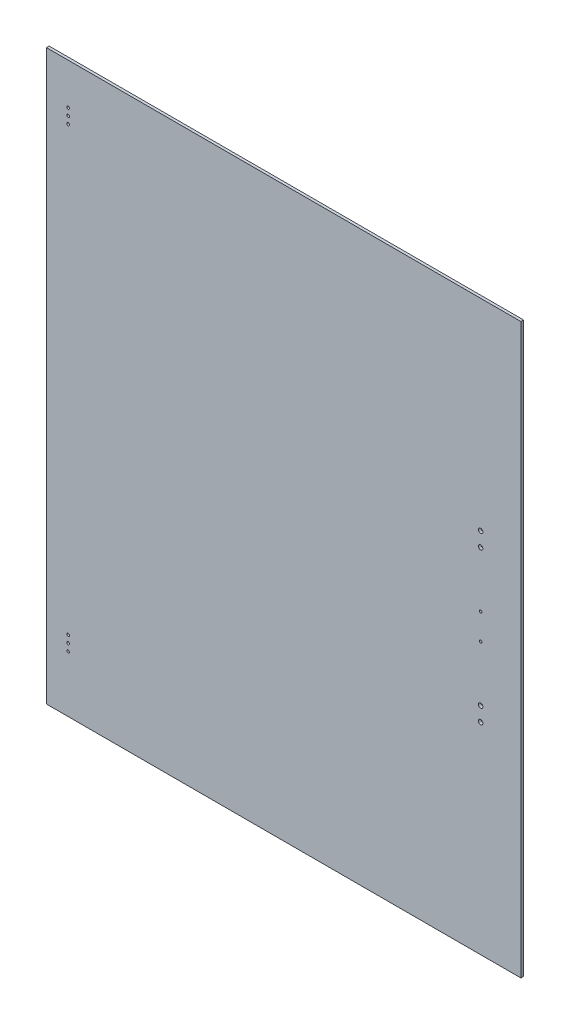
ISO-10303-21;
HEADER;
FILE_DESCRIPTION(('STEP AP214'),'2;1');
FILE_NAME('part.step','',(''),(''),'','','');
FILE_SCHEMA(('AUTOMOTIVE_DESIGN { 1 0 10303 214 1 1 1 1 }'));
ENDSEC;
DATA;
#1=APPLICATION_CONTEXT('core data for automotive mechanical design processes');
#2=APPLICATION_PROTOCOL_DEFINITION('international standard','automotive_design',2000,#1);
#3=PRODUCT_CONTEXT('',#1,'mechanical');
#4=PRODUCT('Part','Part','',(#3));
#5=PRODUCT_RELATED_PRODUCT_CATEGORY('part','',(#4));
#6=PRODUCT_DEFINITION_FORMATION('','',#4);
#7=PRODUCT_DEFINITION_CONTEXT('part definition',#1,'design');
#8=PRODUCT_DEFINITION('design','',#6,#7);
#9=PRODUCT_DEFINITION_SHAPE('','',#8);
#10=(LENGTH_UNIT() NAMED_UNIT(*) SI_UNIT(.MILLI.,.METRE.));
#11=(NAMED_UNIT(*) PLANE_ANGLE_UNIT() SI_UNIT($,.RADIAN.));
#12=(NAMED_UNIT(*) SI_UNIT($,.STERADIAN.) SOLID_ANGLE_UNIT());
#13=UNCERTAINTY_MEASURE_WITH_UNIT(LENGTH_MEASURE(1.E-05),#10,'distance_accuracy_value','');
#14=(GEOMETRIC_REPRESENTATION_CONTEXT(3) GLOBAL_UNCERTAINTY_ASSIGNED_CONTEXT((#13)) GLOBAL_UNIT_ASSIGNED_CONTEXT((#10,
#11,#12)) REPRESENTATION_CONTEXT('',''));
#15=CARTESIAN_POINT('',(0.,0.,0.));
#16=DIRECTION('',(0.,0.,1.));
#17=DIRECTION('',(1.,0.,0.));
#18=AXIS2_PLACEMENT_3D('',#15,#16,#17);
#19=CARTESIAN_POINT('',(-476.504854368932,294.757281553398,3.));
#20=DIRECTION('',(1.,0.,0.));
#21=DIRECTION('',(0.,0.,-1.));
#22=AXIS2_PLACEMENT_3D('',#19,#20,#21);
#23=PLANE('',#22);
#24=DIRECTION('',(0.,-1.,0.));
#25=VECTOR('',#24,1.);
#26=CARTESIAN_POINT('',(-476.504854368932,294.757281553398,0.));
#27=LINE('',#26,#25);
#28=CARTESIAN_POINT('',(-476.504854368932,294.757281553398,0.));
#29=VERTEX_POINT('',#28);
#30=CARTESIAN_POINT('',(-476.504854368932,-340.242718446602,0.));
#31=VERTEX_POINT('',#30);
#32=EDGE_CURVE('E96',#29,#31,#27,.T.);
#33=ORIENTED_EDGE('',*,*,#32,.T.);
#34=DIRECTION('',(0.,0.,-1.));
#35=VECTOR('',#34,1.);
#36=CARTESIAN_POINT('',(-476.504854368932,-340.242718446602,3.));
#37=LINE('',#36,#35);
#38=CARTESIAN_POINT('',(-476.504854368932,-340.242718446602,3.));
#39=VERTEX_POINT('',#38);
#40=EDGE_CURVE('E11',#39,#31,#37,.T.);
#41=ORIENTED_EDGE('',*,*,#40,.F.);
#42=DIRECTION('',(0.,-1.,0.));
#43=VECTOR('',#42,1.);
#44=CARTESIAN_POINT('',(-476.504854368932,294.757281553398,3.));
#45=LINE('',#44,#43);
#46=CARTESIAN_POINT('',(-476.504854368932,294.757281553398,3.));
#47=VERTEX_POINT('',#46);
#48=EDGE_CURVE('E84',#47,#39,#45,.T.);
#49=ORIENTED_EDGE('',*,*,#48,.F.);
#50=DIRECTION('',(0.,0.,-1.));
#51=VECTOR('',#50,1.);
#52=CARTESIAN_POINT('',(-476.504854368932,294.757281553398,3.));
#53=LINE('',#52,#51);
#54=EDGE_CURVE('E92',#47,#29,#53,.T.);
#55=ORIENTED_EDGE('',*,*,#54,.T.);
#56=EDGE_LOOP('',(#33,#41,#49,#55));
#57=FACE_BOUND('',#56,.T.);
#58=ADVANCED_FACE('F33',(#57),#23,.F.);
#59=CARTESIAN_POINT('',(-476.504854368932,-340.242718446602,3.));
#60=DIRECTION('',(0.,1.,0.));
#61=DIRECTION('',(0.,0.,1.));
#62=AXIS2_PLACEMENT_3D('',#59,#60,#61);
#63=PLANE('',#62);
#64=DIRECTION('',(1.,0.,0.));
#65=VECTOR('',#64,1.);
#66=CARTESIAN_POINT('',(-476.504854368932,-340.242718446602,0.));
#67=LINE('',#66,#65);
#68=CARTESIAN_POINT('',(53.4951456310681,-340.242718446602,0.));
#69=VERTEX_POINT('',#68);
#70=EDGE_CURVE('E88',#31,#69,#67,.T.);
#71=ORIENTED_EDGE('',*,*,#70,.T.);
#72=DIRECTION('',(0.,0.,-1.));
#73=VECTOR('',#72,1.);
#74=CARTESIAN_POINT('',(53.4951456310681,-340.242718446602,3.));
#75=LINE('',#74,#73);
#76=CARTESIAN_POINT('',(53.4951456310681,-340.242718446602,3.));
#77=VERTEX_POINT('',#76);
#78=EDGE_CURVE('E41',#77,#69,#75,.T.);
#79=ORIENTED_EDGE('',*,*,#78,.F.);
#80=DIRECTION('',(1.,0.,0.));
#81=VECTOR('',#80,1.);
#82=CARTESIAN_POINT('',(-476.504854368932,-340.242718446602,3.));
#83=LINE('',#82,#81);
#84=EDGE_CURVE('E79',#39,#77,#83,.T.);
#85=ORIENTED_EDGE('',*,*,#84,.F.);
#86=ORIENTED_EDGE('',*,*,#40,.T.);
#87=EDGE_LOOP('',(#71,#79,#85,#86));
#88=FACE_BOUND('',#87,.T.);
#89=ADVANCED_FACE('F87',(#88),#63,.F.);
#90=CARTESIAN_POINT('',(53.4951456310679,294.757281553398,3.));
#91=DIRECTION('',(-1.,0.,0.));
#92=DIRECTION('',(0.,-1.,0.));
#93=AXIS2_PLACEMENT_3D('',#90,#91,#92);
#94=PLANE('',#93);
#95=DIRECTION('',(0.,1.,0.));
#96=VECTOR('',#95,1.);
#97=CARTESIAN_POINT('',(53.4951456310679,294.757281553398,0.));
#98=LINE('',#97,#96);
#99=CARTESIAN_POINT('',(53.4951456310679,294.757281553398,0.));
#100=VERTEX_POINT('',#99);
#101=EDGE_CURVE('E66',#69,#100,#98,.T.);
#102=ORIENTED_EDGE('',*,*,#101,.T.);
#103=DIRECTION('',(0.,0.,-1.));
#104=VECTOR('',#103,1.);
#105=CARTESIAN_POINT('',(53.4951456310679,294.757281553398,3.));
#106=LINE('',#105,#104);
#107=CARTESIAN_POINT('',(53.4951456310679,294.757281553398,3.));
#108=VERTEX_POINT('',#107);
#109=EDGE_CURVE('E89',#108,#100,#106,.T.);
#110=ORIENTED_EDGE('',*,*,#109,.F.);
#111=DIRECTION('',(0.,1.,0.));
#112=VECTOR('',#111,1.);
#113=CARTESIAN_POINT('',(53.4951456310679,294.757281553398,3.));
#114=LINE('',#113,#112);
#115=EDGE_CURVE('E82',#77,#108,#114,.T.);
#116=ORIENTED_EDGE('',*,*,#115,.F.);
#117=ORIENTED_EDGE('',*,*,#78,.T.);
#118=EDGE_LOOP('',(#102,#110,#116,#117));
#119=FACE_BOUND('',#118,.T.);
#120=ADVANCED_FACE('F90',(#119),#94,.F.);
#121=CARTESIAN_POINT('',(-476.504854368932,294.757281553398,3.));
#122=DIRECTION('',(0.,-1.,0.));
#123=DIRECTION('',(0.,0.,-1.));
#124=AXIS2_PLACEMENT_3D('',#121,#122,#123);
#125=PLANE('',#124);
#126=DIRECTION('',(-1.,0.,0.));
#127=VECTOR('',#126,1.);
#128=CARTESIAN_POINT('',(-476.504854368932,294.757281553398,0.));
#129=LINE('',#128,#127);
#130=EDGE_CURVE('E72',#100,#29,#129,.T.);
#131=ORIENTED_EDGE('',*,*,#130,.T.);
#132=ORIENTED_EDGE('',*,*,#54,.F.);
#133=DIRECTION('',(-1.,0.,0.));
#134=VECTOR('',#133,1.);
#135=CARTESIAN_POINT('',(-476.504854368932,294.757281553398,3.));
#136=LINE('',#135,#134);
#137=EDGE_CURVE('E49',#108,#47,#136,.T.);
#138=ORIENTED_EDGE('',*,*,#137,.F.);
#139=ORIENTED_EDGE('',*,*,#109,.T.);
#140=EDGE_LOOP('',(#131,#132,#138,#139));
#141=FACE_BOUND('',#140,.T.);
#142=ADVANCED_FACE('F104',(#141),#125,.F.);
#143=CARTESIAN_POINT('',(0.,0.,3.));
#144=DIRECTION('',(0.,0.,1.));
#145=DIRECTION('',(1.,0.,0.));
#146=AXIS2_PLACEMENT_3D('',#143,#144,#145);
#147=PLANE('',#146);
#148=CARTESIAN_POINT('',(8.49514563106798,69.7572815533979,3.));
#149=DIRECTION('',(0.,0.,1.));
#150=DIRECTION('',(1.,0.,0.));
#151=AXIS2_PLACEMENT_3D('',#148,#149,#150);
#152=CIRCLE('',#151,2.5);
#153=CARTESIAN_POINT('',(10.995145631068,69.7572815533979,3.));
#154=VERTEX_POINT('',#153);
#155=EDGE_CURVE('E159',#154,#154,#152,.T.);
#156=ORIENTED_EDGE('',*,*,#155,.F.);
#157=EDGE_LOOP('',(#156));
#158=FACE_BOUND('',#157,.T.);
#159=CARTESIAN_POINT('',(8.49514563106802,-8.24271844660204,3.));
#160=DIRECTION('',(0.,0.,1.));
#161=DIRECTION('',(1.,0.,0.));
#162=AXIS2_PLACEMENT_3D('',#159,#160,#161);
#163=CIRCLE('',#162,1.5);
#164=CARTESIAN_POINT('',(9.99514563106803,-8.24271844660204,3.));
#165=VERTEX_POINT('',#164);
#166=EDGE_CURVE('E172',#165,#165,#163,.T.);
#167=ORIENTED_EDGE('',*,*,#166,.F.);
#168=EDGE_LOOP('',(#167));
#169=FACE_BOUND('',#168,.T.);
#170=CARTESIAN_POINT('',(8.49514563106804,53.7572815533979,3.));
#171=DIRECTION('',(0.,0.,1.));
#172=DIRECTION('',(1.,0.,0.));
#173=AXIS2_PLACEMENT_3D('',#170,#171,#172);
#174=CIRCLE('',#173,2.5);
#175=CARTESIAN_POINT('',(10.995145631068,53.7572815533979,3.));
#176=VERTEX_POINT('',#175);
#177=EDGE_CURVE('E153',#176,#176,#174,.T.);
#178=ORIENTED_EDGE('',*,*,#177,.F.);
#179=EDGE_LOOP('',(#178));
#180=FACE_BOUND('',#179,.T.);
#181=CARTESIAN_POINT('',(8.49514563106801,-99.2427184466021,3.));
#182=DIRECTION('',(0.,0.,1.));
#183=DIRECTION('',(1.,0.,0.));
#184=AXIS2_PLACEMENT_3D('',#181,#182,#183);
#185=CIRCLE('',#184,2.5);
#186=CARTESIAN_POINT('',(10.995145631068,-99.2427184466021,3.));
#187=VERTEX_POINT('',#186);
#188=EDGE_CURVE('E146',#187,#187,#185,.T.);
#189=ORIENTED_EDGE('',*,*,#188,.F.);
#190=EDGE_LOOP('',(#189));
#191=FACE_BOUND('',#190,.T.);
#192=CARTESIAN_POINT('',(8.49514563106801,-115.242718446602,3.));
#193=DIRECTION('',(0.,0.,1.));
#194=DIRECTION('',(1.,0.,0.));
#195=AXIS2_PLACEMENT_3D('',#192,#193,#194);
#196=CIRCLE('',#195,2.5);
#197=CARTESIAN_POINT('',(10.995145631068,-115.242718446602,3.));
#198=VERTEX_POINT('',#197);
#199=EDGE_CURVE('E167',#198,#198,#196,.T.);
#200=ORIENTED_EDGE('',*,*,#199,.F.);
#201=EDGE_LOOP('',(#200));
#202=FACE_BOUND('',#201,.T.);
#203=CARTESIAN_POINT('',(8.49514563106801,-37.242718446602,3.));
#204=DIRECTION('',(0.,0.,1.));
#205=DIRECTION('',(1.,0.,0.));
#206=AXIS2_PLACEMENT_3D('',#203,#204,#205);
#207=CIRCLE('',#206,1.5);
#208=CARTESIAN_POINT('',(9.99514563106801,-37.242718446602,3.));
#209=VERTEX_POINT('',#208);
#210=EDGE_CURVE('E160',#209,#209,#207,.T.);
#211=ORIENTED_EDGE('',*,*,#210,.F.);
#212=EDGE_LOOP('',(#211));
#213=FACE_BOUND('',#212,.T.);
#214=CARTESIAN_POINT('',(-452.244854368932,248.757281553398,3.));
#215=DIRECTION('',(0.,0.,1.));
#216=DIRECTION('',(1.,0.,0.));
#217=AXIS2_PLACEMENT_3D('',#214,#215,#216);
#218=CIRCLE('',#217,1.50000000000002);
#219=CARTESIAN_POINT('',(-450.744854368932,248.757281553398,3.));
#220=VERTEX_POINT('',#219);
#221=EDGE_CURVE('E141',#220,#220,#218,.T.);
#222=ORIENTED_EDGE('',*,*,#221,.F.);
#223=EDGE_LOOP('',(#222));
#224=FACE_BOUND('',#223,.T.);
#225=CARTESIAN_POINT('',(-452.244854368932,240.757281553398,3.));
#226=DIRECTION('',(0.,0.,1.));
#227=DIRECTION('',(1.,0.,0.));
#228=AXIS2_PLACEMENT_3D('',#225,#226,#227);
#229=CIRCLE('',#228,1.50000000000002);
#230=CARTESIAN_POINT('',(-450.744854368932,240.757281553398,3.));
#231=VERTEX_POINT('',#230);
#232=EDGE_CURVE('E135',#231,#231,#229,.T.);
#233=ORIENTED_EDGE('',*,*,#232,.F.);
#234=EDGE_LOOP('',(#233));
#235=FACE_BOUND('',#234,.T.);
#236=CARTESIAN_POINT('',(-452.244854368932,232.757281553398,3.));
#237=DIRECTION('',(0.,0.,1.));
#238=DIRECTION('',(1.,0.,0.));
#239=AXIS2_PLACEMENT_3D('',#236,#237,#238);
#240=CIRCLE('',#239,1.50000000000002);
#241=CARTESIAN_POINT('',(-450.744854368932,232.757281553398,3.));
#242=VERTEX_POINT('',#241);
#243=EDGE_CURVE('E129',#242,#242,#240,.T.);
#244=ORIENTED_EDGE('',*,*,#243,.F.);
#245=EDGE_LOOP('',(#244));
#246=FACE_BOUND('',#245,.T.);
#247=CARTESIAN_POINT('',(-452.244854368932,-261.242718446602,3.));
#248=DIRECTION('',(0.,0.,1.));
#249=DIRECTION('',(1.,0.,0.));
#250=AXIS2_PLACEMENT_3D('',#247,#248,#249);
#251=CIRCLE('',#250,1.50000000000002);
#252=CARTESIAN_POINT('',(-450.744854368932,-261.242718446602,3.));
#253=VERTEX_POINT('',#252);
#254=EDGE_CURVE('E123',#253,#253,#251,.T.);
#255=ORIENTED_EDGE('',*,*,#254,.F.);
#256=EDGE_LOOP('',(#255));
#257=FACE_BOUND('',#256,.T.);
#258=CARTESIAN_POINT('',(-452.244854368932,-269.242718446602,3.));
#259=DIRECTION('',(0.,0.,1.));
#260=DIRECTION('',(1.,0.,0.));
#261=AXIS2_PLACEMENT_3D('',#258,#259,#260);
#262=CIRCLE('',#261,1.50000000000002);
#263=CARTESIAN_POINT('',(-450.744854368932,-269.242718446602,3.));
#264=VERTEX_POINT('',#263);
#265=EDGE_CURVE('E117',#264,#264,#262,.T.);
#266=ORIENTED_EDGE('',*,*,#265,.F.);
#267=EDGE_LOOP('',(#266));
#268=FACE_BOUND('',#267,.T.);
#269=CARTESIAN_POINT('',(-452.244854368932,-277.242718446602,3.));
#270=DIRECTION('',(0.,0.,1.));
#271=DIRECTION('',(1.,0.,0.));
#272=AXIS2_PLACEMENT_3D('',#269,#270,#271);
#273=CIRCLE('',#272,1.50000000000002);
#274=CARTESIAN_POINT('',(-450.744854368932,-277.242718446602,3.));
#275=VERTEX_POINT('',#274);
#276=EDGE_CURVE('E110',#275,#275,#273,.T.);
#277=ORIENTED_EDGE('',*,*,#276,.F.);
#278=EDGE_LOOP('',(#277));
#279=FACE_BOUND('',#278,.T.);
#280=ORIENTED_EDGE('',*,*,#48,.T.);
#281=ORIENTED_EDGE('',*,*,#84,.T.);
#282=ORIENTED_EDGE('',*,*,#115,.T.);
#283=ORIENTED_EDGE('',*,*,#137,.T.);
#284=EDGE_LOOP('',(#280,#281,#282,#283));
#285=FACE_BOUND('',#284,.T.);
#286=ADVANCED_FACE('F80',(#158,#169,#180,#191,#202,#213,#224,#235,#246,#257,#268,#279,#285),
#147,.T.);
#287=CARTESIAN_POINT('',(0.,0.,0.));
#288=DIRECTION('',(0.,0.,1.));
#289=DIRECTION('',(1.,0.,0.));
#290=AXIS2_PLACEMENT_3D('',#287,#288,#289);
#291=PLANE('',#290);
#292=CARTESIAN_POINT('',(8.49514563106798,69.7572815533979,0.));
#293=DIRECTION('',(0.,0.,1.));
#294=DIRECTION('',(1.,0.,0.));
#295=AXIS2_PLACEMENT_3D('',#292,#293,#294);
#296=CIRCLE('',#295,2.5);
#297=CARTESIAN_POINT('',(10.995145631068,69.7572815533979,0.));
#298=VERTEX_POINT('',#297);
#299=EDGE_CURVE('E114',#298,#298,#296,.T.);
#300=ORIENTED_EDGE('',*,*,#299,.T.);
#301=EDGE_LOOP('',(#300));
#302=FACE_BOUND('',#301,.T.);
#303=CARTESIAN_POINT('',(8.49514563106802,-8.24271844660204,0.));
#304=DIRECTION('',(0.,0.,1.));
#305=DIRECTION('',(1.,0.,0.));
#306=AXIS2_PLACEMENT_3D('',#303,#304,#305);
#307=CIRCLE('',#306,1.5);
#308=CARTESIAN_POINT('',(9.99514563106803,-8.24271844660204,0.));
#309=VERTEX_POINT('',#308);
#310=EDGE_CURVE('E164',#309,#309,#307,.T.);
#311=ORIENTED_EDGE('',*,*,#310,.T.);
#312=EDGE_LOOP('',(#311));
#313=FACE_BOUND('',#312,.T.);
#314=CARTESIAN_POINT('',(8.49514563106804,53.7572815533979,0.));
#315=DIRECTION('',(0.,0.,1.));
#316=DIRECTION('',(1.,0.,0.));
#317=AXIS2_PLACEMENT_3D('',#314,#315,#316);
#318=CIRCLE('',#317,2.5);
#319=CARTESIAN_POINT('',(10.995145631068,53.7572815533979,0.));
#320=VERTEX_POINT('',#319);
#321=EDGE_CURVE('E156',#320,#320,#318,.T.);
#322=ORIENTED_EDGE('',*,*,#321,.T.);
#323=EDGE_LOOP('',(#322));
#324=FACE_BOUND('',#323,.T.);
#325=CARTESIAN_POINT('',(8.49514563106801,-99.2427184466021,0.));
#326=DIRECTION('',(0.,0.,1.));
#327=DIRECTION('',(1.,0.,0.));
#328=AXIS2_PLACEMENT_3D('',#325,#326,#327);
#329=CIRCLE('',#328,2.5);
#330=CARTESIAN_POINT('',(10.995145631068,-99.2427184466021,0.));
#331=VERTEX_POINT('',#330);
#332=EDGE_CURVE('E149',#331,#331,#329,.T.);
#333=ORIENTED_EDGE('',*,*,#332,.T.);
#334=EDGE_LOOP('',(#333));
#335=FACE_BOUND('',#334,.T.);
#336=CARTESIAN_POINT('',(8.49514563106801,-115.242718446602,0.));
#337=DIRECTION('',(0.,0.,1.));
#338=DIRECTION('',(1.,0.,0.));
#339=AXIS2_PLACEMENT_3D('',#336,#337,#338);
#340=CIRCLE('',#339,2.5);
#341=CARTESIAN_POINT('',(10.995145631068,-115.242718446602,0.));
#342=VERTEX_POINT('',#341);
#343=EDGE_CURVE('E150',#342,#342,#340,.T.);
#344=ORIENTED_EDGE('',*,*,#343,.T.);
#345=EDGE_LOOP('',(#344));
#346=FACE_BOUND('',#345,.T.);
#347=CARTESIAN_POINT('',(8.49514563106801,-37.242718446602,0.));
#348=DIRECTION('',(0.,0.,1.));
#349=DIRECTION('',(1.,0.,0.));
#350=AXIS2_PLACEMENT_3D('',#347,#348,#349);
#351=CIRCLE('',#350,1.5);
#352=CARTESIAN_POINT('',(9.99514563106801,-37.242718446602,0.));
#353=VERTEX_POINT('',#352);
#354=EDGE_CURVE('E163',#353,#353,#351,.T.);
#355=ORIENTED_EDGE('',*,*,#354,.T.);
#356=EDGE_LOOP('',(#355));
#357=FACE_BOUND('',#356,.T.);
#358=CARTESIAN_POINT('',(-452.244854368932,248.757281553398,0.));
#359=DIRECTION('',(0.,0.,1.));
#360=DIRECTION('',(1.,0.,0.));
#361=AXIS2_PLACEMENT_3D('',#358,#359,#360);
#362=CIRCLE('',#361,1.50000000000002);
#363=CARTESIAN_POINT('',(-450.744854368932,248.757281553398,0.));
#364=VERTEX_POINT('',#363);
#365=EDGE_CURVE('E99',#364,#364,#362,.T.);
#366=ORIENTED_EDGE('',*,*,#365,.T.);
#367=EDGE_LOOP('',(#366));
#368=FACE_BOUND('',#367,.T.);
#369=CARTESIAN_POINT('',(-452.244854368932,240.757281553398,0.));
#370=DIRECTION('',(0.,0.,1.));
#371=DIRECTION('',(1.,0.,0.));
#372=AXIS2_PLACEMENT_3D('',#369,#370,#371);
#373=CIRCLE('',#372,1.50000000000002);
#374=CARTESIAN_POINT('',(-450.744854368932,240.757281553398,0.));
#375=VERTEX_POINT('',#374);
#376=EDGE_CURVE('E138',#375,#375,#373,.T.);
#377=ORIENTED_EDGE('',*,*,#376,.T.);
#378=EDGE_LOOP('',(#377));
#379=FACE_BOUND('',#378,.T.);
#380=CARTESIAN_POINT('',(-452.244854368932,232.757281553398,0.));
#381=DIRECTION('',(0.,0.,1.));
#382=DIRECTION('',(1.,0.,0.));
#383=AXIS2_PLACEMENT_3D('',#380,#381,#382);
#384=CIRCLE('',#383,1.50000000000002);
#385=CARTESIAN_POINT('',(-450.744854368932,232.757281553398,0.));
#386=VERTEX_POINT('',#385);
#387=EDGE_CURVE('E132',#386,#386,#384,.T.);
#388=ORIENTED_EDGE('',*,*,#387,.T.);
#389=EDGE_LOOP('',(#388));
#390=FACE_BOUND('',#389,.T.);
#391=CARTESIAN_POINT('',(-452.244854368932,-261.242718446602,0.));
#392=DIRECTION('',(0.,0.,1.));
#393=DIRECTION('',(1.,0.,0.));
#394=AXIS2_PLACEMENT_3D('',#391,#392,#393);
#395=CIRCLE('',#394,1.50000000000002);
#396=CARTESIAN_POINT('',(-450.744854368932,-261.242718446602,0.));
#397=VERTEX_POINT('',#396);
#398=EDGE_CURVE('E126',#397,#397,#395,.T.);
#399=ORIENTED_EDGE('',*,*,#398,.T.);
#400=EDGE_LOOP('',(#399));
#401=FACE_BOUND('',#400,.T.);
#402=CARTESIAN_POINT('',(-452.244854368932,-269.242718446602,0.));
#403=DIRECTION('',(0.,0.,1.));
#404=DIRECTION('',(1.,0.,0.));
#405=AXIS2_PLACEMENT_3D('',#402,#403,#404);
#406=CIRCLE('',#405,1.50000000000002);
#407=CARTESIAN_POINT('',(-450.744854368932,-269.242718446602,0.));
#408=VERTEX_POINT('',#407);
#409=EDGE_CURVE('E120',#408,#408,#406,.T.);
#410=ORIENTED_EDGE('',*,*,#409,.T.);
#411=EDGE_LOOP('',(#410));
#412=FACE_BOUND('',#411,.T.);
#413=CARTESIAN_POINT('',(-452.244854368932,-277.242718446602,0.));
#414=DIRECTION('',(0.,0.,1.));
#415=DIRECTION('',(1.,0.,0.));
#416=AXIS2_PLACEMENT_3D('',#413,#414,#415);
#417=CIRCLE('',#416,1.50000000000002);
#418=CARTESIAN_POINT('',(-450.744854368932,-277.242718446602,0.));
#419=VERTEX_POINT('',#418);
#420=EDGE_CURVE('E113',#419,#419,#417,.T.);
#421=ORIENTED_EDGE('',*,*,#420,.T.);
#422=EDGE_LOOP('',(#421));
#423=FACE_BOUND('',#422,.T.);
#424=ORIENTED_EDGE('',*,*,#32,.F.);
#425=ORIENTED_EDGE('',*,*,#130,.F.);
#426=ORIENTED_EDGE('',*,*,#101,.F.);
#427=ORIENTED_EDGE('',*,*,#70,.F.);
#428=EDGE_LOOP('',(#424,#425,#426,#427));
#429=FACE_BOUND('',#428,.T.);
#430=ADVANCED_FACE('F107',(#302,#313,#324,#335,#346,#357,#368,#379,#390,#401,#412,#423,#429),
#291,.F.);
#431=CARTESIAN_POINT('',(-452.244854368932,-277.242718446602,0.));
#432=DIRECTION('',(0.,0.,1.));
#433=DIRECTION('',(1.,0.,0.));
#434=AXIS2_PLACEMENT_3D('',#431,#432,#433);
#435=CYLINDRICAL_SURFACE('',#434,1.50000000000002);
#436=ORIENTED_EDGE('',*,*,#420,.F.);
#437=EDGE_LOOP('',(#436));
#438=FACE_BOUND('',#437,.T.);
#439=ORIENTED_EDGE('',*,*,#276,.T.);
#440=EDGE_LOOP('',(#439));
#441=FACE_BOUND('',#440,.T.);
#442=ADVANCED_FACE('F216',(#438,#441),#435,.F.);
#443=CARTESIAN_POINT('',(-452.244854368932,-269.242718446602,0.));
#444=DIRECTION('',(0.,0.,1.));
#445=DIRECTION('',(1.,0.,0.));
#446=AXIS2_PLACEMENT_3D('',#443,#444,#445);
#447=CYLINDRICAL_SURFACE('',#446,1.50000000000002);
#448=ORIENTED_EDGE('',*,*,#409,.F.);
#449=EDGE_LOOP('',(#448));
#450=FACE_BOUND('',#449,.T.);
#451=ORIENTED_EDGE('',*,*,#265,.T.);
#452=EDGE_LOOP('',(#451));
#453=FACE_BOUND('',#452,.T.);
#454=ADVANCED_FACE('F218',(#450,#453),#447,.F.);
#455=CARTESIAN_POINT('',(-452.244854368932,-261.242718446602,0.));
#456=DIRECTION('',(0.,0.,1.));
#457=DIRECTION('',(1.,0.,0.));
#458=AXIS2_PLACEMENT_3D('',#455,#456,#457);
#459=CYLINDRICAL_SURFACE('',#458,1.50000000000002);
#460=ORIENTED_EDGE('',*,*,#398,.F.);
#461=EDGE_LOOP('',(#460));
#462=FACE_BOUND('',#461,.T.);
#463=ORIENTED_EDGE('',*,*,#254,.T.);
#464=EDGE_LOOP('',(#463));
#465=FACE_BOUND('',#464,.T.);
#466=ADVANCED_FACE('F225',(#462,#465),#459,.F.);
#467=CARTESIAN_POINT('',(-452.244854368932,232.757281553398,0.));
#468=DIRECTION('',(0.,0.,1.));
#469=DIRECTION('',(1.,0.,0.));
#470=AXIS2_PLACEMENT_3D('',#467,#468,#469);
#471=CYLINDRICAL_SURFACE('',#470,1.50000000000002);
#472=ORIENTED_EDGE('',*,*,#387,.F.);
#473=EDGE_LOOP('',(#472));
#474=FACE_BOUND('',#473,.T.);
#475=ORIENTED_EDGE('',*,*,#243,.T.);
#476=EDGE_LOOP('',(#475));
#477=FACE_BOUND('',#476,.T.);
#478=ADVANCED_FACE('F324',(#474,#477),#471,.F.);
#479=CARTESIAN_POINT('',(-452.244854368932,240.757281553398,0.));
#480=DIRECTION('',(0.,0.,1.));
#481=DIRECTION('',(1.,0.,0.));
#482=AXIS2_PLACEMENT_3D('',#479,#480,#481);
#483=CYLINDRICAL_SURFACE('',#482,1.50000000000002);
#484=ORIENTED_EDGE('',*,*,#376,.F.);
#485=EDGE_LOOP('',(#484));
#486=FACE_BOUND('',#485,.T.);
#487=ORIENTED_EDGE('',*,*,#232,.T.);
#488=EDGE_LOOP('',(#487));
#489=FACE_BOUND('',#488,.T.);
#490=ADVANCED_FACE('F320',(#486,#489),#483,.F.);
#491=CARTESIAN_POINT('',(-452.244854368932,248.757281553398,0.));
#492=DIRECTION('',(0.,0.,1.));
#493=DIRECTION('',(1.,0.,0.));
#494=AXIS2_PLACEMENT_3D('',#491,#492,#493);
#495=CYLINDRICAL_SURFACE('',#494,1.50000000000002);
#496=ORIENTED_EDGE('',*,*,#365,.F.);
#497=EDGE_LOOP('',(#496));
#498=FACE_BOUND('',#497,.T.);
#499=ORIENTED_EDGE('',*,*,#221,.T.);
#500=EDGE_LOOP('',(#499));
#501=FACE_BOUND('',#500,.T.);
#502=ADVANCED_FACE('F265',(#498,#501),#495,.F.);
#503=CARTESIAN_POINT('',(8.49514563106801,-37.242718446602,0.));
#504=DIRECTION('',(0.,0.,1.));
#505=DIRECTION('',(1.,0.,0.));
#506=AXIS2_PLACEMENT_3D('',#503,#504,#505);
#507=CYLINDRICAL_SURFACE('',#506,1.5);
#508=ORIENTED_EDGE('',*,*,#354,.F.);
#509=EDGE_LOOP('',(#508));
#510=FACE_BOUND('',#509,.T.);
#511=ORIENTED_EDGE('',*,*,#210,.T.);
#512=EDGE_LOOP('',(#511));
#513=FACE_BOUND('',#512,.T.);
#514=ADVANCED_FACE('F259',(#510,#513),#507,.F.);
#515=CARTESIAN_POINT('',(8.49514563106801,-115.242718446602,0.));
#516=DIRECTION('',(0.,0.,1.));
#517=DIRECTION('',(1.,0.,0.));
#518=AXIS2_PLACEMENT_3D('',#515,#516,#517);
#519=CYLINDRICAL_SURFACE('',#518,2.5);
#520=ORIENTED_EDGE('',*,*,#343,.F.);
#521=EDGE_LOOP('',(#520));
#522=FACE_BOUND('',#521,.T.);
#523=ORIENTED_EDGE('',*,*,#199,.T.);
#524=EDGE_LOOP('',(#523));
#525=FACE_BOUND('',#524,.T.);
#526=ADVANCED_FACE('F264',(#522,#525),#519,.F.);
#527=CARTESIAN_POINT('',(8.49514563106801,-99.2427184466021,0.));
#528=DIRECTION('',(0.,0.,1.));
#529=DIRECTION('',(1.,0.,0.));
#530=AXIS2_PLACEMENT_3D('',#527,#528,#529);
#531=CYLINDRICAL_SURFACE('',#530,2.5);
#532=ORIENTED_EDGE('',*,*,#332,.F.);
#533=EDGE_LOOP('',(#532));
#534=FACE_BOUND('',#533,.T.);
#535=ORIENTED_EDGE('',*,*,#188,.T.);
#536=EDGE_LOOP('',(#535));
#537=FACE_BOUND('',#536,.T.);
#538=ADVANCED_FACE('F277',(#534,#537),#531,.F.);
#539=CARTESIAN_POINT('',(8.49514563106804,53.7572815533979,0.));
#540=DIRECTION('',(0.,0.,1.));
#541=DIRECTION('',(1.,0.,0.));
#542=AXIS2_PLACEMENT_3D('',#539,#540,#541);
#543=CYLINDRICAL_SURFACE('',#542,2.5);
#544=ORIENTED_EDGE('',*,*,#321,.F.);
#545=EDGE_LOOP('',(#544));
#546=FACE_BOUND('',#545,.T.);
#547=ORIENTED_EDGE('',*,*,#177,.T.);
#548=EDGE_LOOP('',(#547));
#549=FACE_BOUND('',#548,.T.);
#550=ADVANCED_FACE('F287',(#546,#549),#543,.F.);
#551=CARTESIAN_POINT('',(8.49514563106802,-8.24271844660204,0.));
#552=DIRECTION('',(0.,0.,1.));
#553=DIRECTION('',(1.,0.,0.));
#554=AXIS2_PLACEMENT_3D('',#551,#552,#553);
#555=CYLINDRICAL_SURFACE('',#554,1.5);
#556=ORIENTED_EDGE('',*,*,#310,.F.);
#557=EDGE_LOOP('',(#556));
#558=FACE_BOUND('',#557,.T.);
#559=ORIENTED_EDGE('',*,*,#166,.T.);
#560=EDGE_LOOP('',(#559));
#561=FACE_BOUND('',#560,.T.);
#562=ADVANCED_FACE('F187',(#558,#561),#555,.F.);
#563=CARTESIAN_POINT('',(8.49514563106798,69.7572815533979,0.));
#564=DIRECTION('',(0.,0.,1.));
#565=DIRECTION('',(1.,0.,0.));
#566=AXIS2_PLACEMENT_3D('',#563,#564,#565);
#567=CYLINDRICAL_SURFACE('',#566,2.5);
#568=ORIENTED_EDGE('',*,*,#299,.F.);
#569=EDGE_LOOP('',(#568));
#570=FACE_BOUND('',#569,.T.);
#571=ORIENTED_EDGE('',*,*,#155,.T.);
#572=EDGE_LOOP('',(#571));
#573=FACE_BOUND('',#572,.T.);
#574=ADVANCED_FACE('F184',(#570,#573),#567,.F.);
#575=CLOSED_SHELL('',(#58,#89,#120,#142,#286,#430,#442,#454,#466,#478,#490,#502,#514,#526,#538,
#550,#562,#574));
#576=MANIFOLD_SOLID_BREP('B2',#575);
#577=ADVANCED_BREP_SHAPE_REPRESENTATION('',(#18,#576),#14);
#578=SHAPE_DEFINITION_REPRESENTATION(#9,#577);
ENDSEC;
END-ISO-10303-21;
